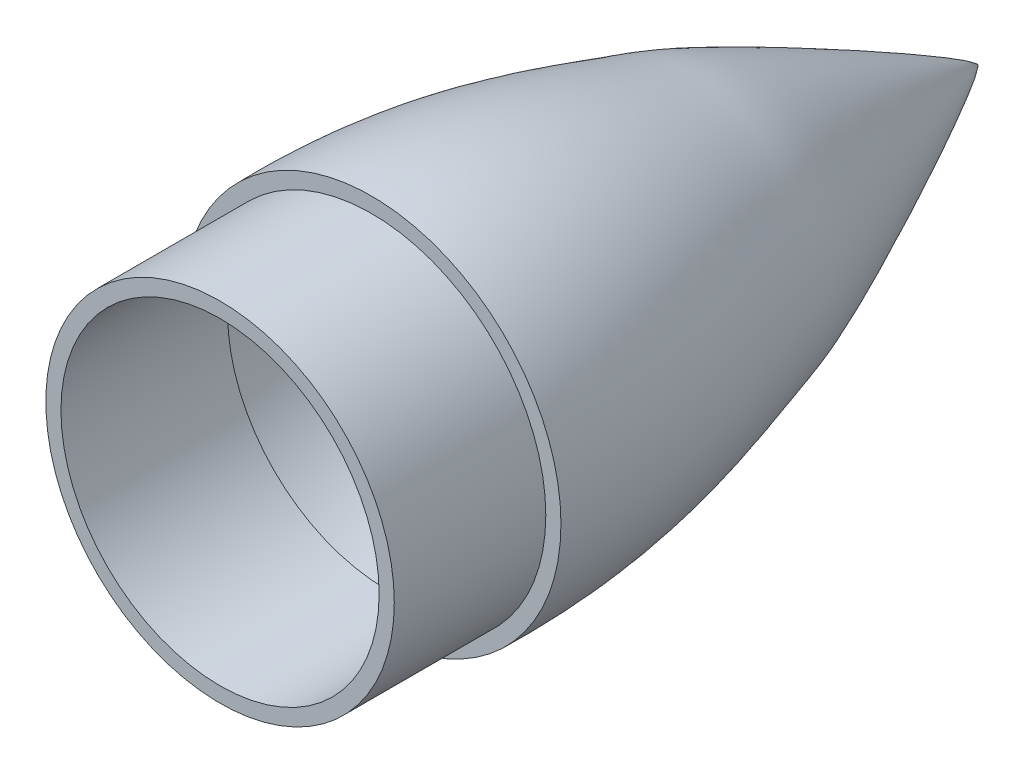
ISO-10303-21;
HEADER;
FILE_DESCRIPTION(('STEP AP214'),'2;1');
FILE_NAME('part.step','',(''),(''),'','','');
FILE_SCHEMA(('AUTOMOTIVE_DESIGN { 1 0 10303 214 1 1 1 1 }'));
ENDSEC;
DATA;
#1=APPLICATION_CONTEXT('core data for automotive mechanical design processes');
#2=APPLICATION_PROTOCOL_DEFINITION('international standard','automotive_design',2000,#1);
#3=PRODUCT_CONTEXT('',#1,'mechanical');
#4=PRODUCT('Part','Part','',(#3));
#5=PRODUCT_RELATED_PRODUCT_CATEGORY('part','',(#4));
#6=PRODUCT_DEFINITION_FORMATION('','',#4);
#7=PRODUCT_DEFINITION_CONTEXT('part definition',#1,'design');
#8=PRODUCT_DEFINITION('design','',#6,#7);
#9=PRODUCT_DEFINITION_SHAPE('','',#8);
#10=(LENGTH_UNIT() NAMED_UNIT(*) SI_UNIT(.MILLI.,.METRE.));
#11=(NAMED_UNIT(*) PLANE_ANGLE_UNIT() SI_UNIT($,.RADIAN.));
#12=(NAMED_UNIT(*) SI_UNIT($,.STERADIAN.) SOLID_ANGLE_UNIT());
#13=UNCERTAINTY_MEASURE_WITH_UNIT(LENGTH_MEASURE(1.E-05),#10,'distance_accuracy_value','');
#14=(GEOMETRIC_REPRESENTATION_CONTEXT(3) GLOBAL_UNCERTAINTY_ASSIGNED_CONTEXT((#13)) GLOBAL_UNIT_ASSIGNED_CONTEXT((#10,
#11,#12)) REPRESENTATION_CONTEXT('',''));
#15=CARTESIAN_POINT('',(0.,0.,0.));
#16=DIRECTION('',(0.,0.,1.));
#17=DIRECTION('',(1.,0.,0.));
#18=AXIS2_PLACEMENT_3D('',#15,#16,#17);
#19=CARTESIAN_POINT('',(0.,0.,-80.));
#20=CARTESIAN_POINT('',(-1.10820374337107,0.,-79.7902496282556));
#21=CARTESIAN_POINT('',(-15.3337261469221,0.,-51.5733466830331));
#22=CARTESIAN_POINT('',(-20.4075306524081,0.,-33.8925587086693));
#23=CARTESIAN_POINT('',(-25.3345041768905,0.,-19.1075279172899));
#24=CARTESIAN_POINT('',(-25.,0.,0.));
#25=B_SPLINE_CURVE_WITH_KNOTS('',3,(#19,#20,#21,#22,#23,#24),.UNSPECIFIED.,.F.,.F.,(4,1,1,4),
(0.,0.398194333901342,0.498194333901342,1.),.UNSPECIFIED.);
#26=CARTESIAN_POINT('',(0.,0.,20.));
#27=DIRECTION('',(0.,0.,1.));
#28=AXIS1_PLACEMENT('',#26,#27);
#29=SURFACE_OF_REVOLUTION('',#25,#28);
#30=CARTESIAN_POINT('',(0.,0.,0.));
#31=DIRECTION('',(0.,0.,1.));
#32=DIRECTION('',(1.,0.,0.));
#33=AXIS2_PLACEMENT_3D('',#30,#31,#32);
#34=CIRCLE('',#33,25.);
#35=CARTESIAN_POINT('',(25.,0.,0.));
#36=VERTEX_POINT('',#35);
#37=EDGE_CURVE('E11',#36,#36,#34,.T.);
#38=ORIENTED_EDGE('',*,*,#37,.F.);
#39=EDGE_LOOP('',(#38));
#40=FACE_BOUND('',#39,.T.);
#41=CARTESIAN_POINT('',(0.,0.,-80.));
#42=VERTEX_POINT('',#41);
#43=VERTEX_LOOP('',#42);
#44=FACE_BOUND('',#43,.T.);
#45=ADVANCED_FACE('F34',(#40,#44),#29,.T.);
#46=CARTESIAN_POINT('',(-25.,0.,0.));
#47=DIRECTION('',(0.,0.,-1.));
#48=DIRECTION('',(-1.,0.,0.));
#49=AXIS2_PLACEMENT_3D('',#46,#47,#48);
#50=PLANE('',#49);
#51=CARTESIAN_POINT('',(0.,0.,0.));
#52=DIRECTION('',(0.,0.,1.));
#53=DIRECTION('',(1.,0.,0.));
#54=AXIS2_PLACEMENT_3D('',#51,#52,#53);
#55=CIRCLE('',#54,23.);
#56=CARTESIAN_POINT('',(23.,0.,0.));
#57=VERTEX_POINT('',#56);
#58=EDGE_CURVE('E42',#57,#57,#55,.T.);
#59=ORIENTED_EDGE('',*,*,#58,.F.);
#60=EDGE_LOOP('',(#59));
#61=FACE_BOUND('',#60,.T.);
#62=ORIENTED_EDGE('',*,*,#37,.T.);
#63=EDGE_LOOP('',(#62));
#64=FACE_BOUND('',#63,.T.);
#65=ADVANCED_FACE('F93',(#61,#64),#50,.F.);
#66=CARTESIAN_POINT('',(0.,0.,20.));
#67=DIRECTION('',(0.,0.,1.));
#68=DIRECTION('',(1.,0.,0.));
#69=AXIS2_PLACEMENT_3D('',#66,#67,#68);
#70=CYLINDRICAL_SURFACE('',#69,23.);
#71=CARTESIAN_POINT('',(0.,0.,20.));
#72=DIRECTION('',(0.,0.,1.));
#73=DIRECTION('',(1.,0.,0.));
#74=AXIS2_PLACEMENT_3D('',#71,#72,#73);
#75=CIRCLE('',#74,23.);
#76=CARTESIAN_POINT('',(23.,0.,20.));
#77=VERTEX_POINT('',#76);
#78=EDGE_CURVE('E58',#77,#77,#75,.T.);
#79=ORIENTED_EDGE('',*,*,#78,.F.);
#80=EDGE_LOOP('',(#79));
#81=FACE_BOUND('',#80,.T.);
#82=ORIENTED_EDGE('',*,*,#58,.T.);
#83=EDGE_LOOP('',(#82));
#84=FACE_BOUND('',#83,.T.);
#85=ADVANCED_FACE('F90',(#81,#84),#70,.T.);
#86=CARTESIAN_POINT('',(-21.7436635561616,0.,20.));
#87=DIRECTION('',(0.,0.,-1.));
#88=DIRECTION('',(-1.,0.,0.));
#89=AXIS2_PLACEMENT_3D('',#86,#87,#88);
#90=PLANE('',#89);
#91=CARTESIAN_POINT('',(0.,0.,20.));
#92=DIRECTION('',(0.,0.,-1.));
#93=DIRECTION('',(-1.,0.,0.));
#94=AXIS2_PLACEMENT_3D('',#91,#92,#93);
#95=CIRCLE('',#94,21.);
#96=CARTESIAN_POINT('',(-21.,0.,20.));
#97=VERTEX_POINT('',#96);
#98=EDGE_CURVE('E64',#97,#97,#95,.F.);
#99=ORIENTED_EDGE('',*,*,#98,.F.);
#100=EDGE_LOOP('',(#99));
#101=FACE_BOUND('',#100,.T.);
#102=ORIENTED_EDGE('',*,*,#78,.T.);
#103=EDGE_LOOP('',(#102));
#104=FACE_BOUND('',#103,.T.);
#105=ADVANCED_FACE('F52',(#101,#104),#90,.F.);
#106=CARTESIAN_POINT('',(-1.72882117782193,0.,-77.5150297283984));
#107=CARTESIAN_POINT('',(-5.31969424284928,0.,-71.3414584888688));
#108=CARTESIAN_POINT('',(-15.7339516106396,0.,-50.1786730099975));
#109=CARTESIAN_POINT('',(-20.4075306524081,0.,-33.8925587086693));
#110=CARTESIAN_POINT('',(-25.3345041768905,0.,-19.1075279172899));
#111=CARTESIAN_POINT('',(-25.,0.,0.));
#112=B_SPLINE_CURVE_WITH_KNOTS('',3,(#106,#107,#108,#109,#110,#111),.UNSPECIFIED.,.F.,.F.,(4,1,
1,4),(0.0788807419136393,0.398194333901342,0.498194333901342,1.),.UNSPECIFIED.);
#113=CARTESIAN_POINT('',(0.,0.,20.));
#114=DIRECTION('',(0.,0.,1.));
#115=AXIS1_PLACEMENT('',#113,#114);
#116=SURFACE_OF_REVOLUTION('',#112,#115);
#117=OFFSET_SURFACE('',#116,-2.,.F.);
#118=CARTESIAN_POINT('',(0.,0.,-76.5094565907727));
#119=VERTEX_POINT('',#118);
#120=VERTEX_LOOP('',#119);
#121=FACE_BOUND('',#120,.T.);
#122=CARTESIAN_POINT('',(0.,0.,-1.99999999999999));
#123=DIRECTION('',(0.,0.,1.));
#124=DIRECTION('',(1.,0.,0.));
#125=AXIS2_PLACEMENT_3D('',#122,#123,#124);
#126=CIRCLE('',#125,23.0190686720116);
#127=CARTESIAN_POINT('',(23.0190686720116,0.,-1.99999999999999));
#128=VERTEX_POINT('',#127);
#129=EDGE_CURVE('E56',#128,#128,#126,.T.);
#130=ORIENTED_EDGE('',*,*,#129,.T.);
#131=EDGE_LOOP('',(#130));
#132=FACE_BOUND('',#131,.T.);
#133=ADVANCED_FACE('F48',(#121,#132),#117,.F.);
#134=CARTESIAN_POINT('',(-25.,0.,-2.));
#135=DIRECTION('',(0.,0.,-1.));
#136=DIRECTION('',(-1.,0.,0.));
#137=AXIS2_PLACEMENT_3D('',#134,#135,#136);
#138=PLANE('',#137);
#139=CARTESIAN_POINT('',(0.,0.,-2.));
#140=DIRECTION('',(0.,0.,-1.));
#141=DIRECTION('',(-1.,0.,0.));
#142=AXIS2_PLACEMENT_3D('',#139,#140,#141);
#143=CIRCLE('',#142,21.);
#144=CARTESIAN_POINT('',(-21.,0.,-2.));
#145=VERTEX_POINT('',#144);
#146=EDGE_CURVE('E59',#145,#145,#143,.F.);
#147=ORIENTED_EDGE('',*,*,#146,.T.);
#148=EDGE_LOOP('',(#147));
#149=FACE_BOUND('',#148,.T.);
#150=ORIENTED_EDGE('',*,*,#129,.F.);
#151=EDGE_LOOP('',(#150));
#152=FACE_BOUND('',#151,.T.);
#153=ADVANCED_FACE('F51',(#149,#152),#138,.T.);
#154=CARTESIAN_POINT('',(0.,0.,20.));
#155=DIRECTION('',(0.,0.,1.));
#156=DIRECTION('',(1.,0.,0.));
#157=AXIS2_PLACEMENT_3D('',#154,#155,#156);
#158=CYLINDRICAL_SURFACE('',#157,21.);
#159=ORIENTED_EDGE('',*,*,#98,.T.);
#160=EDGE_LOOP('',(#159));
#161=FACE_BOUND('',#160,.T.);
#162=ORIENTED_EDGE('',*,*,#146,.F.);
#163=EDGE_LOOP('',(#162));
#164=FACE_BOUND('',#163,.T.);
#165=ADVANCED_FACE('F83',(#161,#164),#158,.F.);
#166=CLOSED_SHELL('',(#45,#65,#85,#105,#133,#153,#165));
#167=MANIFOLD_SOLID_BREP('B2',#166);
#168=ADVANCED_BREP_SHAPE_REPRESENTATION('',(#18,#167),#14);
#169=SHAPE_DEFINITION_REPRESENTATION(#9,#168);
ENDSEC;
END-ISO-10303-21;
